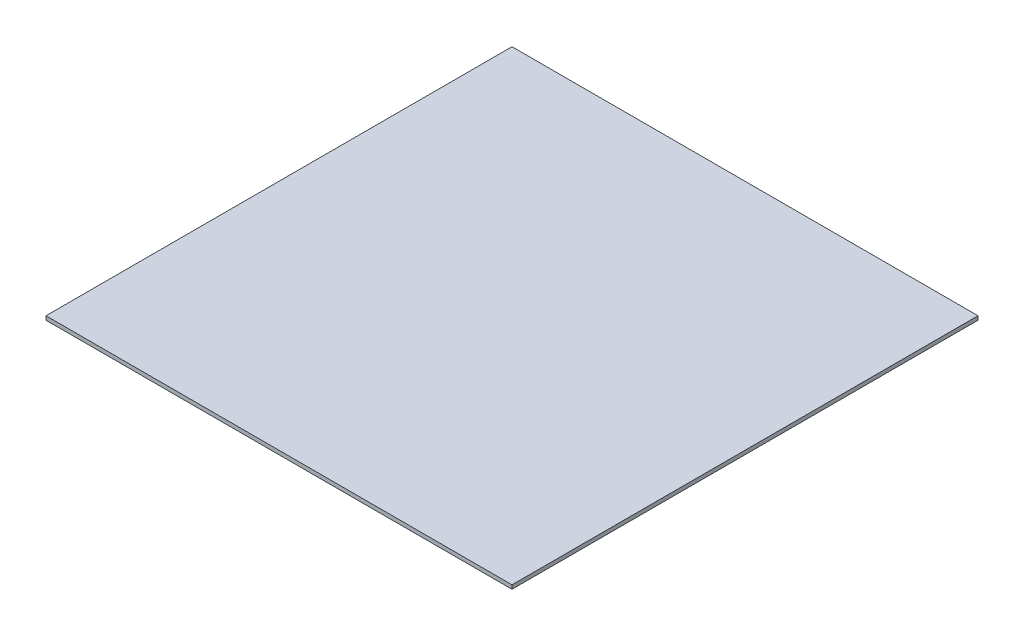
ISO-10303-21;
HEADER;
FILE_DESCRIPTION(('STEP AP214'),'2;1');
FILE_NAME('part.step','',(''),(''),'','','');
FILE_SCHEMA(('AUTOMOTIVE_DESIGN { 1 0 10303 214 1 1 1 1 }'));
ENDSEC;
DATA;
#1=APPLICATION_CONTEXT('core data for automotive mechanical design processes');
#2=APPLICATION_PROTOCOL_DEFINITION('international standard','automotive_design',2000,#1);
#3=PRODUCT_CONTEXT('',#1,'mechanical');
#4=PRODUCT('Part','Part','',(#3));
#5=PRODUCT_RELATED_PRODUCT_CATEGORY('part','',(#4));
#6=PRODUCT_DEFINITION_FORMATION('','',#4);
#7=PRODUCT_DEFINITION_CONTEXT('part definition',#1,'design');
#8=PRODUCT_DEFINITION('design','',#6,#7);
#9=PRODUCT_DEFINITION_SHAPE('','',#8);
#10=(LENGTH_UNIT() NAMED_UNIT(*) SI_UNIT(.MILLI.,.METRE.));
#11=(NAMED_UNIT(*) PLANE_ANGLE_UNIT() SI_UNIT($,.RADIAN.));
#12=(NAMED_UNIT(*) SI_UNIT($,.STERADIAN.) SOLID_ANGLE_UNIT());
#13=UNCERTAINTY_MEASURE_WITH_UNIT(LENGTH_MEASURE(1.E-05),#10,'distance_accuracy_value','');
#14=(GEOMETRIC_REPRESENTATION_CONTEXT(3) GLOBAL_UNCERTAINTY_ASSIGNED_CONTEXT((#13)) GLOBAL_UNIT_ASSIGNED_CONTEXT((#10,
#11,#12)) REPRESENTATION_CONTEXT('',''));
#15=CARTESIAN_POINT('',(0.,0.,0.));
#16=DIRECTION('',(0.,0.,1.));
#17=DIRECTION('',(1.,0.,0.));
#18=AXIS2_PLACEMENT_3D('',#15,#16,#17);
#19=CARTESIAN_POINT('',(-120.,1.,120.));
#20=DIRECTION('',(1.,0.,0.));
#21=DIRECTION('',(0.,0.,-1.));
#22=AXIS2_PLACEMENT_3D('',#19,#20,#21);
#23=PLANE('',#22);
#24=DIRECTION('',(0.,0.,1.));
#25=VECTOR('',#24,1.);
#26=CARTESIAN_POINT('',(-120.,-1.,120.));
#27=LINE('',#26,#25);
#28=CARTESIAN_POINT('',(-120.,-1.,-120.));
#29=VERTEX_POINT('',#28);
#30=CARTESIAN_POINT('',(-120.,-1.,120.));
#31=VERTEX_POINT('',#30);
#32=EDGE_CURVE('E100',#29,#31,#27,.T.);
#33=ORIENTED_EDGE('',*,*,#32,.T.);
#34=DIRECTION('',(0.,-1.,0.));
#35=VECTOR('',#34,1.);
#36=CARTESIAN_POINT('',(-120.,1.,120.));
#37=LINE('',#36,#35);
#38=CARTESIAN_POINT('',(-120.,1.,120.));
#39=VERTEX_POINT('',#38);
#40=EDGE_CURVE('E11',#39,#31,#37,.T.);
#41=ORIENTED_EDGE('',*,*,#40,.F.);
#42=DIRECTION('',(0.,0.,1.));
#43=VECTOR('',#42,1.);
#44=CARTESIAN_POINT('',(-120.,1.,120.));
#45=LINE('',#44,#43);
#46=CARTESIAN_POINT('',(-120.,1.,-120.));
#47=VERTEX_POINT('',#46);
#48=EDGE_CURVE('E88',#47,#39,#45,.T.);
#49=ORIENTED_EDGE('',*,*,#48,.F.);
#50=DIRECTION('',(0.,-1.,0.));
#51=VECTOR('',#50,1.);
#52=CARTESIAN_POINT('',(-120.,1.,-120.));
#53=LINE('',#52,#51);
#54=EDGE_CURVE('E96',#47,#29,#53,.T.);
#55=ORIENTED_EDGE('',*,*,#54,.T.);
#56=EDGE_LOOP('',(#33,#41,#49,#55));
#57=FACE_BOUND('',#56,.T.);
#58=ADVANCED_FACE('F37',(#57),#23,.F.);
#59=CARTESIAN_POINT('',(120.,1.,120.));
#60=DIRECTION('',(0.,0.,-1.));
#61=DIRECTION('',(-1.,0.,0.));
#62=AXIS2_PLACEMENT_3D('',#59,#60,#61);
#63=PLANE('',#62);
#64=DIRECTION('',(1.,0.,0.));
#65=VECTOR('',#64,1.);
#66=CARTESIAN_POINT('',(120.,-1.,120.));
#67=LINE('',#66,#65);
#68=CARTESIAN_POINT('',(120.,-1.,120.));
#69=VERTEX_POINT('',#68);
#70=EDGE_CURVE('E92',#31,#69,#67,.T.);
#71=ORIENTED_EDGE('',*,*,#70,.T.);
#72=DIRECTION('',(0.,-1.,0.));
#73=VECTOR('',#72,1.);
#74=CARTESIAN_POINT('',(120.,1.,120.));
#75=LINE('',#74,#73);
#76=CARTESIAN_POINT('',(120.,1.,120.));
#77=VERTEX_POINT('',#76);
#78=EDGE_CURVE('E45',#77,#69,#75,.T.);
#79=ORIENTED_EDGE('',*,*,#78,.F.);
#80=DIRECTION('',(1.,0.,0.));
#81=VECTOR('',#80,1.);
#82=CARTESIAN_POINT('',(120.,1.,120.));
#83=LINE('',#82,#81);
#84=EDGE_CURVE('E83',#39,#77,#83,.T.);
#85=ORIENTED_EDGE('',*,*,#84,.F.);
#86=ORIENTED_EDGE('',*,*,#40,.T.);
#87=EDGE_LOOP('',(#71,#79,#85,#86));
#88=FACE_BOUND('',#87,.T.);
#89=ADVANCED_FACE('F91',(#88),#63,.F.);
#90=CARTESIAN_POINT('',(120.,1.,120.));
#91=DIRECTION('',(-1.,0.,0.));
#92=DIRECTION('',(0.,0.,1.));
#93=AXIS2_PLACEMENT_3D('',#90,#91,#92);
#94=PLANE('',#93);
#95=DIRECTION('',(0.,0.,-1.));
#96=VECTOR('',#95,1.);
#97=CARTESIAN_POINT('',(120.,-1.,120.));
#98=LINE('',#97,#96);
#99=CARTESIAN_POINT('',(120.,-1.,-120.));
#100=VERTEX_POINT('',#99);
#101=EDGE_CURVE('E70',#69,#100,#98,.T.);
#102=ORIENTED_EDGE('',*,*,#101,.T.);
#103=DIRECTION('',(0.,-1.,0.));
#104=VECTOR('',#103,1.);
#105=CARTESIAN_POINT('',(120.,1.,-120.));
#106=LINE('',#105,#104);
#107=CARTESIAN_POINT('',(120.,1.,-120.));
#108=VERTEX_POINT('',#107);
#109=EDGE_CURVE('E93',#108,#100,#106,.T.);
#110=ORIENTED_EDGE('',*,*,#109,.F.);
#111=DIRECTION('',(0.,0.,-1.));
#112=VECTOR('',#111,1.);
#113=CARTESIAN_POINT('',(120.,1.,120.));
#114=LINE('',#113,#112);
#115=EDGE_CURVE('E86',#77,#108,#114,.T.);
#116=ORIENTED_EDGE('',*,*,#115,.F.);
#117=ORIENTED_EDGE('',*,*,#78,.T.);
#118=EDGE_LOOP('',(#102,#110,#116,#117));
#119=FACE_BOUND('',#118,.T.);
#120=ADVANCED_FACE('F94',(#119),#94,.F.);
#121=CARTESIAN_POINT('',(120.,1.,-120.));
#122=DIRECTION('',(0.,0.,1.));
#123=DIRECTION('',(1.,0.,0.));
#124=AXIS2_PLACEMENT_3D('',#121,#122,#123);
#125=PLANE('',#124);
#126=DIRECTION('',(-1.,0.,0.));
#127=VECTOR('',#126,1.);
#128=CARTESIAN_POINT('',(120.,-1.,-120.));
#129=LINE('',#128,#127);
#130=EDGE_CURVE('E76',#100,#29,#129,.T.);
#131=ORIENTED_EDGE('',*,*,#130,.T.);
#132=ORIENTED_EDGE('',*,*,#54,.F.);
#133=DIRECTION('',(-1.,0.,0.));
#134=VECTOR('',#133,1.);
#135=CARTESIAN_POINT('',(120.,1.,-120.));
#136=LINE('',#135,#134);
#137=EDGE_CURVE('E53',#108,#47,#136,.T.);
#138=ORIENTED_EDGE('',*,*,#137,.F.);
#139=ORIENTED_EDGE('',*,*,#109,.T.);
#140=EDGE_LOOP('',(#131,#132,#138,#139));
#141=FACE_BOUND('',#140,.T.);
#142=ADVANCED_FACE('F107',(#141),#125,.F.);
#143=CARTESIAN_POINT('',(0.,1.,0.));
#144=DIRECTION('',(0.,1.,0.));
#145=DIRECTION('',(0.,0.,1.));
#146=AXIS2_PLACEMENT_3D('',#143,#144,#145);
#147=PLANE('',#146);
#148=ORIENTED_EDGE('',*,*,#48,.T.);
#149=ORIENTED_EDGE('',*,*,#84,.T.);
#150=ORIENTED_EDGE('',*,*,#115,.T.);
#151=ORIENTED_EDGE('',*,*,#137,.T.);
#152=EDGE_LOOP('',(#148,#149,#150,#151));
#153=FACE_BOUND('',#152,.T.);
#154=ADVANCED_FACE('F84',(#153),#147,.T.);
#155=CARTESIAN_POINT('',(0.,-1.,0.));
#156=DIRECTION('',(0.,1.,0.));
#157=DIRECTION('',(0.,0.,1.));
#158=AXIS2_PLACEMENT_3D('',#155,#156,#157);
#159=PLANE('',#158);
#160=ORIENTED_EDGE('',*,*,#32,.F.);
#161=ORIENTED_EDGE('',*,*,#130,.F.);
#162=ORIENTED_EDGE('',*,*,#101,.F.);
#163=ORIENTED_EDGE('',*,*,#70,.F.);
#164=EDGE_LOOP('',(#160,#161,#162,#163));
#165=FACE_BOUND('',#164,.T.);
#166=ADVANCED_FACE('F110',(#165),#159,.F.);
#167=CLOSED_SHELL('',(#58,#89,#120,#142,#154,#166));
#168=MANIFOLD_SOLID_BREP('B2',#167);
#169=ADVANCED_BREP_SHAPE_REPRESENTATION('',(#18,#168),#14);
#170=SHAPE_DEFINITION_REPRESENTATION(#9,#169);
ENDSEC;
END-ISO-10303-21;
